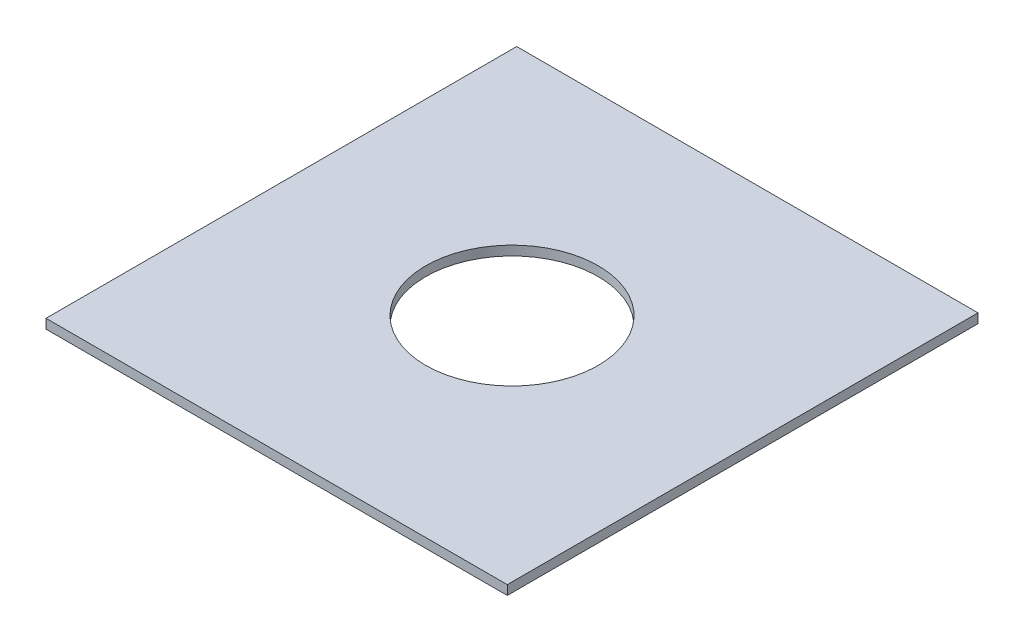
ISO-10303-21;
HEADER;
FILE_DESCRIPTION(('STEP AP214'),'2;1');
FILE_NAME('part.step','',(''),(''),'','','');
FILE_SCHEMA(('AUTOMOTIVE_DESIGN { 1 0 10303 214 1 1 1 1 }'));
ENDSEC;
DATA;
#1=APPLICATION_CONTEXT('core data for automotive mechanical design processes');
#2=APPLICATION_PROTOCOL_DEFINITION('international standard','automotive_design',2000,#1);
#3=PRODUCT_CONTEXT('',#1,'mechanical');
#4=PRODUCT('Part','Part','',(#3));
#5=PRODUCT_RELATED_PRODUCT_CATEGORY('part','',(#4));
#6=PRODUCT_DEFINITION_FORMATION('','',#4);
#7=PRODUCT_DEFINITION_CONTEXT('part definition',#1,'design');
#8=PRODUCT_DEFINITION('design','',#6,#7);
#9=PRODUCT_DEFINITION_SHAPE('','',#8);
#10=(LENGTH_UNIT() NAMED_UNIT(*) SI_UNIT(.MILLI.,.METRE.));
#11=(NAMED_UNIT(*) PLANE_ANGLE_UNIT() SI_UNIT($,.RADIAN.));
#12=(NAMED_UNIT(*) SI_UNIT($,.STERADIAN.) SOLID_ANGLE_UNIT());
#13=UNCERTAINTY_MEASURE_WITH_UNIT(LENGTH_MEASURE(1.E-05),#10,'distance_accuracy_value','');
#14=(GEOMETRIC_REPRESENTATION_CONTEXT(3) GLOBAL_UNCERTAINTY_ASSIGNED_CONTEXT((#13)) GLOBAL_UNIT_ASSIGNED_CONTEXT((#10,
#11,#12)) REPRESENTATION_CONTEXT('',''));
#15=CARTESIAN_POINT('',(0.,0.,0.));
#16=DIRECTION('',(0.,0.,1.));
#17=DIRECTION('',(1.,0.,0.));
#18=AXIS2_PLACEMENT_3D('',#15,#16,#17);
#19=CARTESIAN_POINT('',(0.,6.,0.));
#20=DIRECTION('',(0.,1.,0.));
#21=DIRECTION('',(0.,0.,1.));
#22=AXIS2_PLACEMENT_3D('',#19,#20,#21);
#23=PLANE('',#22);
#24=DIRECTION('',(0.,0.,1.));
#25=VECTOR('',#24,1.);
#26=CARTESIAN_POINT('',(-147.,6.,-150.));
#27=LINE('',#26,#25);
#28=CARTESIAN_POINT('',(-147.,6.,-150.));
#29=VERTEX_POINT('',#28);
#30=CARTESIAN_POINT('',(-147.,6.,150.));
#31=VERTEX_POINT('',#30);
#32=EDGE_CURVE('E84',#29,#31,#27,.T.);
#33=ORIENTED_EDGE('',*,*,#32,.T.);
#34=DIRECTION('',(1.,0.,0.));
#35=VECTOR('',#34,1.);
#36=CARTESIAN_POINT('',(-147.,6.,150.));
#37=LINE('',#36,#35);
#38=CARTESIAN_POINT('',(147.,6.,150.));
#39=VERTEX_POINT('',#38);
#40=EDGE_CURVE('E79',#31,#39,#37,.T.);
#41=ORIENTED_EDGE('',*,*,#40,.T.);
#42=DIRECTION('',(0.,0.,-1.));
#43=VECTOR('',#42,1.);
#44=CARTESIAN_POINT('',(147.,6.,-150.));
#45=LINE('',#44,#43);
#46=CARTESIAN_POINT('',(147.,6.,-150.));
#47=VERTEX_POINT('',#46);
#48=EDGE_CURVE('E82',#39,#47,#45,.T.);
#49=ORIENTED_EDGE('',*,*,#48,.T.);
#50=DIRECTION('',(-1.,0.,0.));
#51=VECTOR('',#50,1.);
#52=CARTESIAN_POINT('',(-147.,6.,-150.));
#53=LINE('',#52,#51);
#54=EDGE_CURVE('E49',#47,#29,#53,.T.);
#55=ORIENTED_EDGE('',*,*,#54,.T.);
#56=EDGE_LOOP('',(#33,#41,#49,#55));
#57=FACE_BOUND('',#56,.T.);
#58=CARTESIAN_POINT('',(0.,6.,0.));
#59=DIRECTION('',(0.,1.,0.));
#60=DIRECTION('',(0.,0.,1.));
#61=AXIS2_PLACEMENT_3D('',#58,#59,#60);
#62=CIRCLE('',#61,55.);
#63=CARTESIAN_POINT('',(0.,6.,55.));
#64=VERTEX_POINT('',#63);
#65=EDGE_CURVE('E99',#64,#64,#62,.T.);
#66=ORIENTED_EDGE('',*,*,#65,.F.);
#67=EDGE_LOOP('',(#66));
#68=FACE_BOUND('',#67,.T.);
#69=ADVANCED_FACE('F32',(#57,#68),#23,.T.);
#70=CARTESIAN_POINT('',(0.,0.,0.));
#71=DIRECTION('',(0.,1.,0.));
#72=DIRECTION('',(0.,0.,1.));
#73=AXIS2_PLACEMENT_3D('',#70,#71,#72);
#74=PLANE('',#73);
#75=DIRECTION('',(0.,0.,1.));
#76=VECTOR('',#75,1.);
#77=CARTESIAN_POINT('',(-147.,0.,-150.));
#78=LINE('',#77,#76);
#79=CARTESIAN_POINT('',(-147.,0.,-150.));
#80=VERTEX_POINT('',#79);
#81=CARTESIAN_POINT('',(-147.,0.,150.));
#82=VERTEX_POINT('',#81);
#83=EDGE_CURVE('E96',#80,#82,#78,.T.);
#84=ORIENTED_EDGE('',*,*,#83,.F.);
#85=DIRECTION('',(-1.,0.,0.));
#86=VECTOR('',#85,1.);
#87=CARTESIAN_POINT('',(-147.,0.,-150.));
#88=LINE('',#87,#86);
#89=CARTESIAN_POINT('',(147.,0.,-150.));
#90=VERTEX_POINT('',#89);
#91=EDGE_CURVE('E72',#90,#80,#88,.T.);
#92=ORIENTED_EDGE('',*,*,#91,.F.);
#93=DIRECTION('',(0.,0.,-1.));
#94=VECTOR('',#93,1.);
#95=CARTESIAN_POINT('',(147.,0.,-150.));
#96=LINE('',#95,#94);
#97=CARTESIAN_POINT('',(147.,0.,150.));
#98=VERTEX_POINT('',#97);
#99=EDGE_CURVE('E66',#98,#90,#96,.T.);
#100=ORIENTED_EDGE('',*,*,#99,.F.);
#101=DIRECTION('',(1.,0.,0.));
#102=VECTOR('',#101,1.);
#103=CARTESIAN_POINT('',(-147.,0.,150.));
#104=LINE('',#103,#102);
#105=EDGE_CURVE('E88',#82,#98,#104,.T.);
#106=ORIENTED_EDGE('',*,*,#105,.F.);
#107=EDGE_LOOP('',(#84,#92,#100,#106));
#108=FACE_BOUND('',#107,.T.);
#109=CARTESIAN_POINT('',(0.,0.,0.));
#110=DIRECTION('',(0.,1.,0.));
#111=DIRECTION('',(0.,0.,1.));
#112=AXIS2_PLACEMENT_3D('',#109,#110,#111);
#113=CIRCLE('',#112,55.);
#114=CARTESIAN_POINT('',(0.,0.,55.));
#115=VERTEX_POINT('',#114);
#116=EDGE_CURVE('E111',#115,#115,#113,.T.);
#117=ORIENTED_EDGE('',*,*,#116,.T.);
#118=EDGE_LOOP('',(#117));
#119=FACE_BOUND('',#118,.T.);
#120=ADVANCED_FACE('F107',(#108,#119),#74,.F.);
#121=CARTESIAN_POINT('',(-147.,6.,-150.));
#122=DIRECTION('',(1.,0.,0.));
#123=DIRECTION('',(0.,0.,-1.));
#124=AXIS2_PLACEMENT_3D('',#121,#122,#123);
#125=PLANE('',#124);
#126=ORIENTED_EDGE('',*,*,#83,.T.);
#127=DIRECTION('',(0.,-1.,0.));
#128=VECTOR('',#127,1.);
#129=CARTESIAN_POINT('',(-147.,6.,150.));
#130=LINE('',#129,#128);
#131=EDGE_CURVE('E11',#31,#82,#130,.T.);
#132=ORIENTED_EDGE('',*,*,#131,.F.);
#133=ORIENTED_EDGE('',*,*,#32,.F.);
#134=DIRECTION('',(0.,-1.,0.));
#135=VECTOR('',#134,1.);
#136=CARTESIAN_POINT('',(-147.,6.,-150.));
#137=LINE('',#136,#135);
#138=EDGE_CURVE('E92',#29,#80,#137,.T.);
#139=ORIENTED_EDGE('',*,*,#138,.T.);
#140=EDGE_LOOP('',(#126,#132,#133,#139));
#141=FACE_BOUND('',#140,.T.);
#142=ADVANCED_FACE('F34',(#141),#125,.F.);
#143=CARTESIAN_POINT('',(-147.,6.,150.));
#144=DIRECTION('',(0.,0.,-1.));
#145=DIRECTION('',(-1.,0.,0.));
#146=AXIS2_PLACEMENT_3D('',#143,#144,#145);
#147=PLANE('',#146);
#148=ORIENTED_EDGE('',*,*,#105,.T.);
#149=DIRECTION('',(0.,-1.,0.));
#150=VECTOR('',#149,1.);
#151=CARTESIAN_POINT('',(147.,6.,150.));
#152=LINE('',#151,#150);
#153=EDGE_CURVE('E41',#39,#98,#152,.T.);
#154=ORIENTED_EDGE('',*,*,#153,.F.);
#155=ORIENTED_EDGE('',*,*,#40,.F.);
#156=ORIENTED_EDGE('',*,*,#131,.T.);
#157=EDGE_LOOP('',(#148,#154,#155,#156));
#158=FACE_BOUND('',#157,.T.);
#159=ADVANCED_FACE('F87',(#158),#147,.F.);
#160=CARTESIAN_POINT('',(147.,6.,-150.));
#161=DIRECTION('',(-1.,0.,0.));
#162=DIRECTION('',(0.,0.,1.));
#163=AXIS2_PLACEMENT_3D('',#160,#161,#162);
#164=PLANE('',#163);
#165=ORIENTED_EDGE('',*,*,#99,.T.);
#166=DIRECTION('',(0.,-1.,0.));
#167=VECTOR('',#166,1.);
#168=CARTESIAN_POINT('',(147.,6.,-150.));
#169=LINE('',#168,#167);
#170=EDGE_CURVE('E89',#47,#90,#169,.T.);
#171=ORIENTED_EDGE('',*,*,#170,.F.);
#172=ORIENTED_EDGE('',*,*,#48,.F.);
#173=ORIENTED_EDGE('',*,*,#153,.T.);
#174=EDGE_LOOP('',(#165,#171,#172,#173));
#175=FACE_BOUND('',#174,.T.);
#176=ADVANCED_FACE('F90',(#175),#164,.F.);
#177=CARTESIAN_POINT('',(-147.,6.,-150.));
#178=DIRECTION('',(0.,0.,1.));
#179=DIRECTION('',(1.,0.,0.));
#180=AXIS2_PLACEMENT_3D('',#177,#178,#179);
#181=PLANE('',#180);
#182=ORIENTED_EDGE('',*,*,#91,.T.);
#183=ORIENTED_EDGE('',*,*,#138,.F.);
#184=ORIENTED_EDGE('',*,*,#54,.F.);
#185=ORIENTED_EDGE('',*,*,#170,.T.);
#186=EDGE_LOOP('',(#182,#183,#184,#185));
#187=FACE_BOUND('',#186,.T.);
#188=ADVANCED_FACE('F104',(#187),#181,.F.);
#189=CARTESIAN_POINT('',(0.,6.,0.));
#190=DIRECTION('',(0.,-1.,0.));
#191=DIRECTION('',(0.,0.,-1.));
#192=AXIS2_PLACEMENT_3D('',#189,#190,#191);
#193=CYLINDRICAL_SURFACE('',#192,55.);
#194=ORIENTED_EDGE('',*,*,#65,.T.);
#195=EDGE_LOOP('',(#194));
#196=FACE_BOUND('',#195,.T.);
#197=ORIENTED_EDGE('',*,*,#116,.F.);
#198=EDGE_LOOP('',(#197));
#199=FACE_BOUND('',#198,.T.);
#200=ADVANCED_FACE('F117',(#196,#199),#193,.F.);
#201=CLOSED_SHELL('',(#69,#120,#142,#159,#176,#188,#200));
#202=MANIFOLD_SOLID_BREP('B2',#201);
#203=ADVANCED_BREP_SHAPE_REPRESENTATION('',(#18,#202),#14);
#204=SHAPE_DEFINITION_REPRESENTATION(#9,#203);
ENDSEC;
END-ISO-10303-21;
